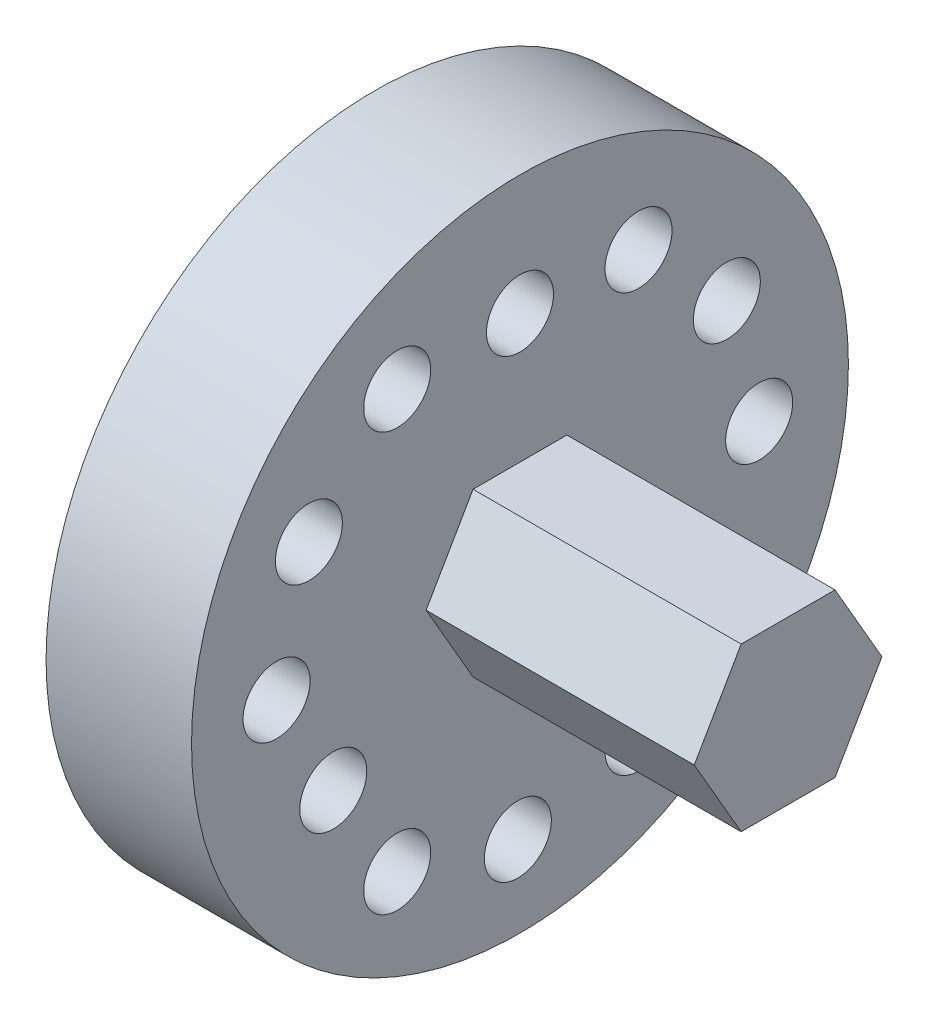
ISO-10303-21;
HEADER;
FILE_DESCRIPTION(('STEP AP214'),'2;1');
FILE_NAME('part.step','',(''),(''),'','','');
FILE_SCHEMA(('AUTOMOTIVE_DESIGN { 1 0 10303 214 1 1 1 1 }'));
ENDSEC;
DATA;
#1=APPLICATION_CONTEXT('core data for automotive mechanical design processes');
#2=APPLICATION_PROTOCOL_DEFINITION('international standard','automotive_design',2000,#1);
#3=PRODUCT_CONTEXT('',#1,'mechanical');
#4=PRODUCT('Part','Part','',(#3));
#5=PRODUCT_RELATED_PRODUCT_CATEGORY('part','',(#4));
#6=PRODUCT_DEFINITION_FORMATION('','',#4);
#7=PRODUCT_DEFINITION_CONTEXT('part definition',#1,'design');
#8=PRODUCT_DEFINITION('design','',#6,#7);
#9=PRODUCT_DEFINITION_SHAPE('','',#8);
#10=(LENGTH_UNIT() NAMED_UNIT(*) SI_UNIT(.MILLI.,.METRE.));
#11=(NAMED_UNIT(*) PLANE_ANGLE_UNIT() SI_UNIT($,.RADIAN.));
#12=(NAMED_UNIT(*) SI_UNIT($,.STERADIAN.) SOLID_ANGLE_UNIT());
#13=UNCERTAINTY_MEASURE_WITH_UNIT(LENGTH_MEASURE(1.E-05),#10,'distance_accuracy_value','');
#14=(GEOMETRIC_REPRESENTATION_CONTEXT(3) GLOBAL_UNCERTAINTY_ASSIGNED_CONTEXT((#13)) GLOBAL_UNIT_ASSIGNED_CONTEXT((#10,
#11,#12)) REPRESENTATION_CONTEXT('',''));
#15=CARTESIAN_POINT('',(0.,0.,0.));
#16=DIRECTION('',(0.,0.,1.));
#17=DIRECTION('',(1.,0.,0.));
#18=AXIS2_PLACEMENT_3D('',#15,#16,#17);
#19=CARTESIAN_POINT('',(10.85,0.,0.));
#20=DIRECTION('',(1.,0.,0.));
#21=DIRECTION('',(0.,0.,-1.));
#22=AXIS2_PLACEMENT_3D('',#19,#20,#21);
#23=PLANE('',#22);
#24=CARTESIAN_POINT('',(10.85,8.64521577321359,15.7458089174074));
#25=DIRECTION('',(1.,0.,0.));
#26=DIRECTION('',(0.,0.,-1.));
#27=AXIS2_PLACEMENT_3D('',#24,#25,#26);
#28=CIRCLE('',#27,2.50000000000076);
#29=CARTESIAN_POINT('',(10.85,8.64521577321359,13.2458089174067));
#30=VERTEX_POINT('',#29);
#31=EDGE_CURVE('E151',#30,#30,#28,.T.);
#32=ORIENTED_EDGE('',*,*,#31,.F.);
#33=EDGE_LOOP('',(#32));
#34=FACE_BOUND('',#33,.T.);
#35=CARTESIAN_POINT('',(10.85,-15.9432414949072,9.15735164928657));
#36=DIRECTION('',(1.,0.,0.));
#37=DIRECTION('',(0.,0.,-1.));
#38=AXIS2_PLACEMENT_3D('',#35,#36,#37);
#39=CIRCLE('',#38,2.50000000000048);
#40=CARTESIAN_POINT('',(10.85,-15.9432414949072,6.65735164928609));
#41=VERTEX_POINT('',#40);
#42=EDGE_CURVE('E163',#41,#41,#39,.T.);
#43=ORIENTED_EDGE('',*,*,#42,.F.);
#44=EDGE_LOOP('',(#43));
#45=FACE_BOUND('',#44,.T.);
#46=CARTESIAN_POINT('',(10.85,-15.9432414949057,-8.84264835071388));
#47=DIRECTION('',(1.,0.,0.));
#48=DIRECTION('',(0.,0.,-1.));
#49=AXIS2_PLACEMENT_3D('',#46,#47,#48);
#50=CIRCLE('',#49,2.50000000000035);
#51=CARTESIAN_POINT('',(10.85,-15.9432414949057,-11.3426483507142));
#52=VERTEX_POINT('',#51);
#53=EDGE_CURVE('E175',#52,#52,#50,.T.);
#54=ORIENTED_EDGE('',*,*,#53,.F.);
#55=EDGE_LOOP('',(#54));
#56=FACE_BOUND('',#55,.T.);
#57=CARTESIAN_POINT('',(10.85,8.64521577321468,-15.4311056188333));
#58=DIRECTION('',(1.,0.,0.));
#59=DIRECTION('',(0.,0.,-1.));
#60=AXIS2_PLACEMENT_3D('',#57,#58,#59);
#61=CIRCLE('',#60,2.49999999999935);
#62=CARTESIAN_POINT('',(10.85,8.64521577321468,-17.9311056188326));
#63=VERTEX_POINT('',#62);
#64=EDGE_CURVE('E187',#63,#63,#61,.T.);
#65=ORIENTED_EDGE('',*,*,#64,.F.);
#66=EDGE_LOOP('',(#65));
#67=FACE_BOUND('',#66,.T.);
#68=CARTESIAN_POINT('',(10.85,-8.30478422678514,-13.6124522708862));
#69=DIRECTION('',(1.,0.,0.));
#70=DIRECTION('',(0.,0.,-1.));
#71=AXIS2_PLACEMENT_3D('',#68,#69,#70);
#72=CIRCLE('',#71,2.50000000000089);
#73=CARTESIAN_POINT('',(10.85,-8.30478422678514,-16.1124522708871));
#74=VERTEX_POINT('',#73);
#75=EDGE_CURVE('E199',#74,#74,#72,.T.);
#76=ORIENTED_EDGE('',*,*,#75,.F.);
#77=EDGE_LOOP('',(#76));
#78=FACE_BOUND('',#77,.T.);
#79=CARTESIAN_POINT('',(10.85,15.5452157732143,0.));
#80=DIRECTION('',(1.,0.,0.));
#81=DIRECTION('',(0.,0.,-1.));
#82=AXIS2_PLACEMENT_3D('',#79,#80,#81);
#83=CIRCLE('',#82,2.5);
#84=CARTESIAN_POINT('',(10.85,15.5452157732143,-2.5));
#85=VERTEX_POINT('',#84);
#86=EDGE_CURVE('E211',#85,#85,#83,.T.);
#87=ORIENTED_EDGE('',*,*,#86,.F.);
#88=EDGE_LOOP('',(#87));
#89=FACE_BOUND('',#88,.T.);
#90=CARTESIAN_POINT('',(10.85,0.,0.));
#91=DIRECTION('',(1.,0.,0.));
#92=DIRECTION('',(0.,0.,-1.));
#93=AXIS2_PLACEMENT_3D('',#90,#91,#92);
#94=CIRCLE('',#93,24.5);
#95=CARTESIAN_POINT('',(10.85,0.,-24.5));
#96=VERTEX_POINT('',#95);
#97=EDGE_CURVE('E11',#96,#96,#94,.T.);
#98=ORIENTED_EDGE('',*,*,#97,.T.);
#99=EDGE_LOOP('',(#98));
#100=FACE_BOUND('',#99,.T.);
#101=CARTESIAN_POINT('',(10.85,15.2336730413342,-8.84264835071259));
#102=DIRECTION('',(1.,0.,0.));
#103=DIRECTION('',(0.,0.,-1.));
#104=AXIS2_PLACEMENT_3D('',#101,#102,#103);
#105=CIRCLE('',#104,2.5);
#106=CARTESIAN_POINT('',(10.85,15.2336730413342,-11.3426483507126));
#107=VERTEX_POINT('',#106);
#108=EDGE_CURVE('E205',#107,#107,#105,.T.);
#109=ORIENTED_EDGE('',*,*,#108,.F.);
#110=EDGE_LOOP('',(#109));
#111=FACE_BOUND('',#110,.T.);
#112=CARTESIAN_POINT('',(10.85,-8.30478422678632,13.927155569459));
#113=DIRECTION('',(1.,0.,0.));
#114=DIRECTION('',(0.,0.,-1.));
#115=AXIS2_PLACEMENT_3D('',#112,#113,#114);
#116=CIRCLE('',#115,2.50000000000128);
#117=CARTESIAN_POINT('',(10.85,-8.30478422678632,11.4271555694577));
#118=VERTEX_POINT('',#117);
#119=EDGE_CURVE('E193',#118,#118,#116,.T.);
#120=ORIENTED_EDGE('',*,*,#119,.F.);
#121=EDGE_LOOP('',(#120));
#122=FACE_BOUND('',#121,.T.);
#123=CARTESIAN_POINT('',(10.85,-0.354784226785372,-17.8426483507141));
#124=DIRECTION('',(1.,0.,0.));
#125=DIRECTION('',(0.,0.,-1.));
#126=AXIS2_PLACEMENT_3D('',#123,#124,#125);
#127=CIRCLE('',#126,2.49999999999915);
#128=CARTESIAN_POINT('',(10.85,-0.354784226785372,-20.3426483507133));
#129=VERTEX_POINT('',#128);
#130=EDGE_CURVE('E181',#129,#129,#127,.T.);
#131=ORIENTED_EDGE('',*,*,#130,.F.);
#132=EDGE_LOOP('',(#131));
#133=FACE_BOUND('',#132,.T.);
#134=CARTESIAN_POINT('',(10.85,-18.3547842267866,0.15735164928614));
#135=DIRECTION('',(1.,0.,0.));
#136=DIRECTION('',(0.,0.,-1.));
#137=AXIS2_PLACEMENT_3D('',#134,#135,#136);
#138=CIRCLE('',#137,2.50000000000031);
#139=CARTESIAN_POINT('',(10.85,-18.3547842267866,-2.34264835071417));
#140=VERTEX_POINT('',#139);
#141=EDGE_CURVE('E169',#140,#140,#138,.T.);
#142=ORIENTED_EDGE('',*,*,#141,.F.);
#143=EDGE_LOOP('',(#142));
#144=FACE_BOUND('',#143,.T.);
#145=CARTESIAN_POINT('',(10.85,-0.354784226786869,18.1573516492868));
#146=DIRECTION('',(1.,0.,0.));
#147=DIRECTION('',(0.,0.,-1.));
#148=AXIS2_PLACEMENT_3D('',#145,#146,#147);
#149=CIRCLE('',#148,2.50000000000138);
#150=CARTESIAN_POINT('',(10.85,-0.354784226786869,15.6573516492854));
#151=VERTEX_POINT('',#150);
#152=EDGE_CURVE('E157',#151,#151,#149,.T.);
#153=ORIENTED_EDGE('',*,*,#152,.F.);
#154=EDGE_LOOP('',(#153));
#155=FACE_BOUND('',#154,.T.);
#156=CARTESIAN_POINT('',(10.85,15.2336730413342,9.15735164928788));
#157=DIRECTION('',(1.,0.,0.));
#158=DIRECTION('',(0.,0.,-1.));
#159=AXIS2_PLACEMENT_3D('',#156,#157,#158);
#160=CIRCLE('',#159,2.50000000000024);
#161=CARTESIAN_POINT('',(10.85,15.2336730413342,6.65735164928764));
#162=VERTEX_POINT('',#161);
#163=EDGE_CURVE('E145',#162,#162,#160,.T.);
#164=ORIENTED_EDGE('',*,*,#163,.F.);
#165=EDGE_LOOP('',(#164));
#166=FACE_BOUND('',#165,.T.);
#167=DIRECTION('',(0.,0.866025403784438,0.5));
#168=VECTOR('',#167,1.);
#169=CARTESIAN_POINT('',(10.85,-0.13086905791027,-7.));
#170=LINE('',#169,#168);
#171=CARTESIAN_POINT('',(10.85,-0.13086905791027,-7.));
#172=VERTEX_POINT('',#171);
#173=CARTESIAN_POINT('',(10.85,5.9313087685808,-3.5));
#174=VERTEX_POINT('',#173);
#175=EDGE_CURVE('E127',#172,#174,#170,.T.);
#176=ORIENTED_EDGE('',*,*,#175,.F.);
#177=DIRECTION('',(0.,0.866025403784439,-0.5));
#178=VECTOR('',#177,1.);
#179=CARTESIAN_POINT('',(10.85,-6.19304688440134,-3.5));
#180=LINE('',#179,#178);
#181=CARTESIAN_POINT('',(10.85,-6.19304688440134,-3.5));
#182=VERTEX_POINT('',#181);
#183=EDGE_CURVE('E124',#182,#172,#180,.T.);
#184=ORIENTED_EDGE('',*,*,#183,.F.);
#185=DIRECTION('',(0.,0.,-1.));
#186=VECTOR('',#185,1.);
#187=CARTESIAN_POINT('',(10.85,-6.19304688440134,3.5));
#188=LINE('',#187,#186);
#189=CARTESIAN_POINT('',(10.85,-6.19304688440134,3.5));
#190=VERTEX_POINT('',#189);
#191=EDGE_CURVE('E83',#190,#182,#188,.T.);
#192=ORIENTED_EDGE('',*,*,#191,.F.);
#193=DIRECTION('',(0.,-0.866025403784439,-0.5));
#194=VECTOR('',#193,1.);
#195=CARTESIAN_POINT('',(10.85,-0.130869057910273,7.));
#196=LINE('',#195,#194);
#197=CARTESIAN_POINT('',(10.85,-0.130869057910273,7.));
#198=VERTEX_POINT('',#197);
#199=EDGE_CURVE('E132',#198,#190,#196,.T.);
#200=ORIENTED_EDGE('',*,*,#199,.F.);
#201=DIRECTION('',(0.,-0.866025403784439,0.5));
#202=VECTOR('',#201,1.);
#203=CARTESIAN_POINT('',(10.85,5.9313087685808,3.5));
#204=LINE('',#203,#202);
#205=CARTESIAN_POINT('',(10.85,5.9313087685808,3.5));
#206=VERTEX_POINT('',#205);
#207=EDGE_CURVE('E113',#206,#198,#204,.T.);
#208=ORIENTED_EDGE('',*,*,#207,.F.);
#209=DIRECTION('',(0.,0.,1.));
#210=VECTOR('',#209,1.);
#211=CARTESIAN_POINT('',(10.85,5.9313087685808,-3.5));
#212=LINE('',#211,#210);
#213=EDGE_CURVE('E129',#174,#206,#212,.T.);
#214=ORIENTED_EDGE('',*,*,#213,.F.);
#215=EDGE_LOOP('',(#176,#184,#192,#200,#208,#214));
#216=FACE_BOUND('',#215,.T.);
#217=ADVANCED_FACE('F40',(#34,#45,#56,#67,#78,#89,#100,#111,#122,#133,#144,#155,#166,#216),#23,.T.);
#218=CARTESIAN_POINT('',(0.,0.,0.));
#219=DIRECTION('',(1.,0.,0.));
#220=DIRECTION('',(0.,0.,-1.));
#221=AXIS2_PLACEMENT_3D('',#218,#219,#220);
#222=PLANE('',#221);
#223=CARTESIAN_POINT('',(0.,0.,0.));
#224=DIRECTION('',(1.,0.,0.));
#225=DIRECTION('',(0.,0.,-1.));
#226=AXIS2_PLACEMENT_3D('',#223,#224,#225);
#227=CIRCLE('',#226,24.5);
#228=CARTESIAN_POINT('',(0.,0.,-24.5));
#229=VERTEX_POINT('',#228);
#230=EDGE_CURVE('E44',#229,#229,#227,.T.);
#231=ORIENTED_EDGE('',*,*,#230,.F.);
#232=EDGE_LOOP('',(#231));
#233=FACE_BOUND('',#232,.T.);
#234=CARTESIAN_POINT('',(0.,15.5452157732143,0.));
#235=DIRECTION('',(1.,0.,0.));
#236=DIRECTION('',(0.,0.,-1.));
#237=AXIS2_PLACEMENT_3D('',#234,#235,#236);
#238=CIRCLE('',#237,2.5);
#239=CARTESIAN_POINT('',(0.,15.5452157732143,-2.5));
#240=VERTEX_POINT('',#239);
#241=EDGE_CURVE('E208',#240,#240,#238,.T.);
#242=ORIENTED_EDGE('',*,*,#241,.T.);
#243=EDGE_LOOP('',(#242));
#244=FACE_BOUND('',#243,.T.);
#245=CARTESIAN_POINT('',(0.,15.2336730413342,-8.84264835071259));
#246=DIRECTION('',(1.,0.,0.));
#247=DIRECTION('',(0.,0.,-1.));
#248=AXIS2_PLACEMENT_3D('',#245,#246,#247);
#249=CIRCLE('',#248,2.5);
#250=CARTESIAN_POINT('',(0.,15.2336730413342,-11.3426483507126));
#251=VERTEX_POINT('',#250);
#252=EDGE_CURVE('E202',#251,#251,#249,.T.);
#253=ORIENTED_EDGE('',*,*,#252,.T.);
#254=EDGE_LOOP('',(#253));
#255=FACE_BOUND('',#254,.T.);
#256=CARTESIAN_POINT('',(0.,-8.30478422678514,-13.6124522708862));
#257=DIRECTION('',(1.,0.,0.));
#258=DIRECTION('',(0.,0.,-1.));
#259=AXIS2_PLACEMENT_3D('',#256,#257,#258);
#260=CIRCLE('',#259,2.50000000000089);
#261=CARTESIAN_POINT('',(0.,-8.30478422678514,-16.1124522708871));
#262=VERTEX_POINT('',#261);
#263=EDGE_CURVE('E196',#262,#262,#260,.T.);
#264=ORIENTED_EDGE('',*,*,#263,.T.);
#265=EDGE_LOOP('',(#264));
#266=FACE_BOUND('',#265,.T.);
#267=CARTESIAN_POINT('',(0.,-8.30478422678632,13.927155569459));
#268=DIRECTION('',(1.,0.,0.));
#269=DIRECTION('',(0.,0.,-1.));
#270=AXIS2_PLACEMENT_3D('',#267,#268,#269);
#271=CIRCLE('',#270,2.50000000000128);
#272=CARTESIAN_POINT('',(0.,-8.30478422678632,11.4271555694577));
#273=VERTEX_POINT('',#272);
#274=EDGE_CURVE('E190',#273,#273,#271,.T.);
#275=ORIENTED_EDGE('',*,*,#274,.T.);
#276=EDGE_LOOP('',(#275));
#277=FACE_BOUND('',#276,.T.);
#278=CARTESIAN_POINT('',(0.,8.64521577321468,-15.4311056188333));
#279=DIRECTION('',(1.,0.,0.));
#280=DIRECTION('',(0.,0.,-1.));
#281=AXIS2_PLACEMENT_3D('',#278,#279,#280);
#282=CIRCLE('',#281,2.49999999999935);
#283=CARTESIAN_POINT('',(0.,8.64521577321468,-17.9311056188326));
#284=VERTEX_POINT('',#283);
#285=EDGE_CURVE('E184',#284,#284,#282,.T.);
#286=ORIENTED_EDGE('',*,*,#285,.T.);
#287=EDGE_LOOP('',(#286));
#288=FACE_BOUND('',#287,.T.);
#289=CARTESIAN_POINT('',(0.,-0.354784226785372,-17.8426483507141));
#290=DIRECTION('',(1.,0.,0.));
#291=DIRECTION('',(0.,0.,-1.));
#292=AXIS2_PLACEMENT_3D('',#289,#290,#291);
#293=CIRCLE('',#292,2.49999999999915);
#294=CARTESIAN_POINT('',(0.,-0.354784226785372,-20.3426483507133));
#295=VERTEX_POINT('',#294);
#296=EDGE_CURVE('E178',#295,#295,#293,.T.);
#297=ORIENTED_EDGE('',*,*,#296,.T.);
#298=EDGE_LOOP('',(#297));
#299=FACE_BOUND('',#298,.T.);
#300=CARTESIAN_POINT('',(0.,-15.9432414949057,-8.84264835071388));
#301=DIRECTION('',(1.,0.,0.));
#302=DIRECTION('',(0.,0.,-1.));
#303=AXIS2_PLACEMENT_3D('',#300,#301,#302);
#304=CIRCLE('',#303,2.50000000000035);
#305=CARTESIAN_POINT('',(0.,-15.9432414949057,-11.3426483507142));
#306=VERTEX_POINT('',#305);
#307=EDGE_CURVE('E172',#306,#306,#304,.T.);
#308=ORIENTED_EDGE('',*,*,#307,.T.);
#309=EDGE_LOOP('',(#308));
#310=FACE_BOUND('',#309,.T.);
#311=CARTESIAN_POINT('',(0.,-18.3547842267866,0.15735164928614));
#312=DIRECTION('',(1.,0.,0.));
#313=DIRECTION('',(0.,0.,-1.));
#314=AXIS2_PLACEMENT_3D('',#311,#312,#313);
#315=CIRCLE('',#314,2.50000000000031);
#316=CARTESIAN_POINT('',(0.,-18.3547842267866,-2.34264835071417));
#317=VERTEX_POINT('',#316);
#318=EDGE_CURVE('E166',#317,#317,#315,.T.);
#319=ORIENTED_EDGE('',*,*,#318,.T.);
#320=EDGE_LOOP('',(#319));
#321=FACE_BOUND('',#320,.T.);
#322=CARTESIAN_POINT('',(0.,-15.9432414949072,9.15735164928657));
#323=DIRECTION('',(1.,0.,0.));
#324=DIRECTION('',(0.,0.,-1.));
#325=AXIS2_PLACEMENT_3D('',#322,#323,#324);
#326=CIRCLE('',#325,2.50000000000048);
#327=CARTESIAN_POINT('',(0.,-15.9432414949072,6.65735164928609));
#328=VERTEX_POINT('',#327);
#329=EDGE_CURVE('E160',#328,#328,#326,.T.);
#330=ORIENTED_EDGE('',*,*,#329,.T.);
#331=EDGE_LOOP('',(#330));
#332=FACE_BOUND('',#331,.T.);
#333=CARTESIAN_POINT('',(0.,-0.354784226786869,18.1573516492868));
#334=DIRECTION('',(1.,0.,0.));
#335=DIRECTION('',(0.,0.,-1.));
#336=AXIS2_PLACEMENT_3D('',#333,#334,#335);
#337=CIRCLE('',#336,2.50000000000138);
#338=CARTESIAN_POINT('',(0.,-0.354784226786869,15.6573516492854));
#339=VERTEX_POINT('',#338);
#340=EDGE_CURVE('E154',#339,#339,#337,.T.);
#341=ORIENTED_EDGE('',*,*,#340,.T.);
#342=EDGE_LOOP('',(#341));
#343=FACE_BOUND('',#342,.T.);
#344=CARTESIAN_POINT('',(0.,8.64521577321359,15.7458089174074));
#345=DIRECTION('',(1.,0.,0.));
#346=DIRECTION('',(0.,0.,-1.));
#347=AXIS2_PLACEMENT_3D('',#344,#345,#346);
#348=CIRCLE('',#347,2.50000000000076);
#349=CARTESIAN_POINT('',(0.,8.64521577321359,13.2458089174067));
#350=VERTEX_POINT('',#349);
#351=EDGE_CURVE('E148',#350,#350,#348,.T.);
#352=ORIENTED_EDGE('',*,*,#351,.T.);
#353=EDGE_LOOP('',(#352));
#354=FACE_BOUND('',#353,.T.);
#355=CARTESIAN_POINT('',(0.,15.2336730413342,9.15735164928788));
#356=DIRECTION('',(1.,0.,0.));
#357=DIRECTION('',(0.,0.,-1.));
#358=AXIS2_PLACEMENT_3D('',#355,#356,#357);
#359=CIRCLE('',#358,2.50000000000024);
#360=CARTESIAN_POINT('',(0.,15.2336730413342,6.65735164928764));
#361=VERTEX_POINT('',#360);
#362=EDGE_CURVE('E144',#361,#361,#359,.T.);
#363=ORIENTED_EDGE('',*,*,#362,.T.);
#364=EDGE_LOOP('',(#363));
#365=FACE_BOUND('',#364,.T.);
#366=ADVANCED_FACE('F217',(#233,#244,#255,#266,#277,#288,#299,#310,#321,#332,#343,#354,#365),
#222,.F.);
#367=CARTESIAN_POINT('',(10.85,0.,0.));
#368=DIRECTION('',(-1.,0.,0.));
#369=DIRECTION('',(0.,0.,1.));
#370=AXIS2_PLACEMENT_3D('',#367,#368,#369);
#371=CYLINDRICAL_SURFACE('',#370,24.5);
#372=ORIENTED_EDGE('',*,*,#97,.F.);
#373=EDGE_LOOP('',(#372));
#374=FACE_BOUND('',#373,.T.);
#375=ORIENTED_EDGE('',*,*,#230,.T.);
#376=EDGE_LOOP('',(#375));
#377=FACE_BOUND('',#376,.T.);
#378=ADVANCED_FACE('F42',(#374,#377),#371,.T.);
#379=CARTESIAN_POINT('',(10.85,15.5452157732143,0.));
#380=DIRECTION('',(-1.,0.,0.));
#381=DIRECTION('',(0.,0.,1.));
#382=AXIS2_PLACEMENT_3D('',#379,#380,#381);
#383=CYLINDRICAL_SURFACE('',#382,2.5);
#384=ORIENTED_EDGE('',*,*,#86,.T.);
#385=EDGE_LOOP('',(#384));
#386=FACE_BOUND('',#385,.T.);
#387=ORIENTED_EDGE('',*,*,#241,.F.);
#388=EDGE_LOOP('',(#387));
#389=FACE_BOUND('',#388,.T.);
#390=ADVANCED_FACE('F220',(#386,#389),#383,.F.);
#391=CARTESIAN_POINT('',(10.85,15.2336730413342,-8.84264835071259));
#392=DIRECTION('',(-1.,0.,0.));
#393=DIRECTION('',(0.,0.,1.));
#394=AXIS2_PLACEMENT_3D('',#391,#392,#393);
#395=CYLINDRICAL_SURFACE('',#394,2.5);
#396=ORIENTED_EDGE('',*,*,#108,.T.);
#397=EDGE_LOOP('',(#396));
#398=FACE_BOUND('',#397,.T.);
#399=ORIENTED_EDGE('',*,*,#252,.F.);
#400=EDGE_LOOP('',(#399));
#401=FACE_BOUND('',#400,.T.);
#402=ADVANCED_FACE('F222',(#398,#401),#395,.F.);
#403=CARTESIAN_POINT('',(10.85,-8.30478422678514,-13.6124522708862));
#404=DIRECTION('',(-1.,0.,0.));
#405=DIRECTION('',(0.,0.,1.));
#406=AXIS2_PLACEMENT_3D('',#403,#404,#405);
#407=CYLINDRICAL_SURFACE('',#406,2.50000000000089);
#408=ORIENTED_EDGE('',*,*,#75,.T.);
#409=EDGE_LOOP('',(#408));
#410=FACE_BOUND('',#409,.T.);
#411=ORIENTED_EDGE('',*,*,#263,.F.);
#412=EDGE_LOOP('',(#411));
#413=FACE_BOUND('',#412,.T.);
#414=ADVANCED_FACE('F229',(#410,#413),#407,.F.);
#415=CARTESIAN_POINT('',(10.85,-8.30478422678632,13.927155569459));
#416=DIRECTION('',(-1.,0.,0.));
#417=DIRECTION('',(0.,0.,1.));
#418=AXIS2_PLACEMENT_3D('',#415,#416,#417);
#419=CYLINDRICAL_SURFACE('',#418,2.50000000000128);
#420=ORIENTED_EDGE('',*,*,#119,.T.);
#421=EDGE_LOOP('',(#420));
#422=FACE_BOUND('',#421,.T.);
#423=ORIENTED_EDGE('',*,*,#274,.F.);
#424=EDGE_LOOP('',(#423));
#425=FACE_BOUND('',#424,.T.);
#426=ADVANCED_FACE('F327',(#422,#425),#419,.F.);
#427=CARTESIAN_POINT('',(10.85,8.64521577321468,-15.4311056188333));
#428=DIRECTION('',(-1.,0.,0.));
#429=DIRECTION('',(0.,0.,1.));
#430=AXIS2_PLACEMENT_3D('',#427,#428,#429);
#431=CYLINDRICAL_SURFACE('',#430,2.49999999999935);
#432=ORIENTED_EDGE('',*,*,#64,.T.);
#433=EDGE_LOOP('',(#432));
#434=FACE_BOUND('',#433,.T.);
#435=ORIENTED_EDGE('',*,*,#285,.F.);
#436=EDGE_LOOP('',(#435));
#437=FACE_BOUND('',#436,.T.);
#438=ADVANCED_FACE('F323',(#434,#437),#431,.F.);
#439=CARTESIAN_POINT('',(10.85,-0.354784226785372,-17.8426483507141));
#440=DIRECTION('',(-1.,0.,0.));
#441=DIRECTION('',(0.,0.,1.));
#442=AXIS2_PLACEMENT_3D('',#439,#440,#441);
#443=CYLINDRICAL_SURFACE('',#442,2.49999999999915);
#444=ORIENTED_EDGE('',*,*,#130,.T.);
#445=EDGE_LOOP('',(#444));
#446=FACE_BOUND('',#445,.T.);
#447=ORIENTED_EDGE('',*,*,#296,.F.);
#448=EDGE_LOOP('',(#447));
#449=FACE_BOUND('',#448,.T.);
#450=ADVANCED_FACE('F319',(#446,#449),#443,.F.);
#451=CARTESIAN_POINT('',(10.85,-15.9432414949057,-8.84264835071388));
#452=DIRECTION('',(-1.,0.,0.));
#453=DIRECTION('',(0.,0.,1.));
#454=AXIS2_PLACEMENT_3D('',#451,#452,#453);
#455=CYLINDRICAL_SURFACE('',#454,2.50000000000035);
#456=ORIENTED_EDGE('',*,*,#53,.T.);
#457=EDGE_LOOP('',(#456));
#458=FACE_BOUND('',#457,.T.);
#459=ORIENTED_EDGE('',*,*,#307,.F.);
#460=EDGE_LOOP('',(#459));
#461=FACE_BOUND('',#460,.T.);
#462=ADVANCED_FACE('F315',(#458,#461),#455,.F.);
#463=CARTESIAN_POINT('',(10.85,-18.3547842267866,0.15735164928614));
#464=DIRECTION('',(-1.,0.,0.));
#465=DIRECTION('',(0.,0.,1.));
#466=AXIS2_PLACEMENT_3D('',#463,#464,#465);
#467=CYLINDRICAL_SURFACE('',#466,2.50000000000031);
#468=ORIENTED_EDGE('',*,*,#141,.T.);
#469=EDGE_LOOP('',(#468));
#470=FACE_BOUND('',#469,.T.);
#471=ORIENTED_EDGE('',*,*,#318,.F.);
#472=EDGE_LOOP('',(#471));
#473=FACE_BOUND('',#472,.T.);
#474=ADVANCED_FACE('F311',(#470,#473),#467,.F.);
#475=CARTESIAN_POINT('',(10.85,-15.9432414949072,9.15735164928657));
#476=DIRECTION('',(-1.,0.,0.));
#477=DIRECTION('',(0.,0.,1.));
#478=AXIS2_PLACEMENT_3D('',#475,#476,#477);
#479=CYLINDRICAL_SURFACE('',#478,2.50000000000048);
#480=ORIENTED_EDGE('',*,*,#42,.T.);
#481=EDGE_LOOP('',(#480));
#482=FACE_BOUND('',#481,.T.);
#483=ORIENTED_EDGE('',*,*,#329,.F.);
#484=EDGE_LOOP('',(#483));
#485=FACE_BOUND('',#484,.T.);
#486=ADVANCED_FACE('F307',(#482,#485),#479,.F.);
#487=CARTESIAN_POINT('',(10.85,-0.354784226786869,18.1573516492868));
#488=DIRECTION('',(-1.,0.,0.));
#489=DIRECTION('',(0.,0.,1.));
#490=AXIS2_PLACEMENT_3D('',#487,#488,#489);
#491=CYLINDRICAL_SURFACE('',#490,2.50000000000138);
#492=ORIENTED_EDGE('',*,*,#152,.T.);
#493=EDGE_LOOP('',(#492));
#494=FACE_BOUND('',#493,.T.);
#495=ORIENTED_EDGE('',*,*,#340,.F.);
#496=EDGE_LOOP('',(#495));
#497=FACE_BOUND('',#496,.T.);
#498=ADVANCED_FACE('F303',(#494,#497),#491,.F.);
#499=CARTESIAN_POINT('',(10.85,8.64521577321359,15.7458089174074));
#500=DIRECTION('',(-1.,0.,0.));
#501=DIRECTION('',(0.,0.,1.));
#502=AXIS2_PLACEMENT_3D('',#499,#500,#501);
#503=CYLINDRICAL_SURFACE('',#502,2.50000000000076);
#504=ORIENTED_EDGE('',*,*,#31,.T.);
#505=EDGE_LOOP('',(#504));
#506=FACE_BOUND('',#505,.T.);
#507=ORIENTED_EDGE('',*,*,#351,.F.);
#508=EDGE_LOOP('',(#507));
#509=FACE_BOUND('',#508,.T.);
#510=ADVANCED_FACE('F299',(#506,#509),#503,.F.);
#511=CARTESIAN_POINT('',(10.85,15.2336730413342,9.15735164928788));
#512=DIRECTION('',(-1.,0.,0.));
#513=DIRECTION('',(0.,0.,1.));
#514=AXIS2_PLACEMENT_3D('',#511,#512,#513);
#515=CYLINDRICAL_SURFACE('',#514,2.50000000000024);
#516=ORIENTED_EDGE('',*,*,#163,.T.);
#517=EDGE_LOOP('',(#516));
#518=FACE_BOUND('',#517,.T.);
#519=ORIENTED_EDGE('',*,*,#362,.F.);
#520=EDGE_LOOP('',(#519));
#521=FACE_BOUND('',#520,.T.);
#522=ADVANCED_FACE('F296',(#518,#521),#515,.F.);
#523=CARTESIAN_POINT('',(30.85,-6.19304688440134,-3.5));
#524=DIRECTION('',(0.,0.5,0.866025403784439));
#525=DIRECTION('',(0.,-0.866025403784439,0.5));
#526=AXIS2_PLACEMENT_3D('',#523,#524,#525);
#527=PLANE('',#526);
#528=ORIENTED_EDGE('',*,*,#183,.T.);
#529=DIRECTION('',(-1.,0.,0.));
#530=VECTOR('',#529,1.);
#531=CARTESIAN_POINT('',(30.85,-0.13086905791027,-7.));
#532=LINE('',#531,#530);
#533=CARTESIAN_POINT('',(30.85,-0.13086905791027,-7.));
#534=VERTEX_POINT('',#533);
#535=EDGE_CURVE('E142',#534,#172,#532,.T.);
#536=ORIENTED_EDGE('',*,*,#535,.F.);
#537=DIRECTION('',(0.,0.866025403784439,-0.5));
#538=VECTOR('',#537,1.);
#539=CARTESIAN_POINT('',(30.85,-6.19304688440134,-3.5));
#540=LINE('',#539,#538);
#541=CARTESIAN_POINT('',(30.85,-6.19304688440134,-3.5));
#542=VERTEX_POINT('',#541);
#543=EDGE_CURVE('E135',#542,#534,#540,.T.);
#544=ORIENTED_EDGE('',*,*,#543,.F.);
#545=DIRECTION('',(-1.,0.,0.));
#546=VECTOR('',#545,1.);
#547=CARTESIAN_POINT('',(30.85,-6.19304688440134,-3.5));
#548=LINE('',#547,#546);
#549=EDGE_CURVE('E120',#542,#182,#548,.T.);
#550=ORIENTED_EDGE('',*,*,#549,.T.);
#551=EDGE_LOOP('',(#528,#536,#544,#550));
#552=FACE_BOUND('',#551,.T.);
#553=ADVANCED_FACE('F277',(#552),#527,.F.);
#554=CARTESIAN_POINT('',(30.85,-0.13086905791027,-7.));
#555=DIRECTION('',(0.,-0.5,0.866025403784439));
#556=DIRECTION('',(0.,-0.866025403784439,-0.5));
#557=AXIS2_PLACEMENT_3D('',#554,#555,#556);
#558=PLANE('',#557);
#559=ORIENTED_EDGE('',*,*,#175,.T.);
#560=DIRECTION('',(-1.,0.,0.));
#561=VECTOR('',#560,1.);
#562=CARTESIAN_POINT('',(30.85,5.9313087685808,-3.5));
#563=LINE('',#562,#561);
#564=CARTESIAN_POINT('',(30.85,5.9313087685808,-3.5));
#565=VERTEX_POINT('',#564);
#566=EDGE_CURVE('E139',#565,#174,#563,.T.);
#567=ORIENTED_EDGE('',*,*,#566,.F.);
#568=DIRECTION('',(0.,0.866025403784438,0.5));
#569=VECTOR('',#568,1.);
#570=CARTESIAN_POINT('',(30.85,-0.13086905791027,-7.));
#571=LINE('',#570,#569);
#572=EDGE_CURVE('E91',#534,#565,#571,.T.);
#573=ORIENTED_EDGE('',*,*,#572,.F.);
#574=ORIENTED_EDGE('',*,*,#535,.T.);
#575=EDGE_LOOP('',(#559,#567,#573,#574));
#576=FACE_BOUND('',#575,.T.);
#577=ADVANCED_FACE('F269',(#576),#558,.F.);
#578=CARTESIAN_POINT('',(30.85,5.9313087685808,-3.5));
#579=DIRECTION('',(0.,-1.,0.));
#580=DIRECTION('',(0.,0.,-1.));
#581=AXIS2_PLACEMENT_3D('',#578,#579,#580);
#582=PLANE('',#581);
#583=ORIENTED_EDGE('',*,*,#213,.T.);
#584=DIRECTION('',(-1.,0.,0.));
#585=VECTOR('',#584,1.);
#586=CARTESIAN_POINT('',(30.85,5.9313087685808,3.5));
#587=LINE('',#586,#585);
#588=CARTESIAN_POINT('',(30.85,5.9313087685808,3.5));
#589=VERTEX_POINT('',#588);
#590=EDGE_CURVE('E116',#589,#206,#587,.T.);
#591=ORIENTED_EDGE('',*,*,#590,.F.);
#592=DIRECTION('',(0.,0.,1.));
#593=VECTOR('',#592,1.);
#594=CARTESIAN_POINT('',(30.85,5.9313087685808,-3.5));
#595=LINE('',#594,#593);
#596=EDGE_CURVE('E104',#565,#589,#595,.T.);
#597=ORIENTED_EDGE('',*,*,#596,.F.);
#598=ORIENTED_EDGE('',*,*,#566,.T.);
#599=EDGE_LOOP('',(#583,#591,#597,#598));
#600=FACE_BOUND('',#599,.T.);
#601=ADVANCED_FACE('F272',(#600),#582,.F.);
#602=CARTESIAN_POINT('',(30.85,5.9313087685808,3.5));
#603=DIRECTION('',(0.,-0.5,-0.866025403784439));
#604=DIRECTION('',(0.,0.866025403784439,-0.5));
#605=AXIS2_PLACEMENT_3D('',#602,#603,#604);
#606=PLANE('',#605);
#607=ORIENTED_EDGE('',*,*,#207,.T.);
#608=DIRECTION('',(-1.,0.,0.));
#609=VECTOR('',#608,1.);
#610=CARTESIAN_POINT('',(30.85,-0.130869057910273,7.));
#611=LINE('',#610,#609);
#612=CARTESIAN_POINT('',(30.85,-0.130869057910273,7.));
#613=VERTEX_POINT('',#612);
#614=EDGE_CURVE('E110',#613,#198,#611,.T.);
#615=ORIENTED_EDGE('',*,*,#614,.F.);
#616=DIRECTION('',(0.,-0.866025403784439,0.5));
#617=VECTOR('',#616,1.);
#618=CARTESIAN_POINT('',(30.85,5.9313087685808,3.5));
#619=LINE('',#618,#617);
#620=EDGE_CURVE('E98',#589,#613,#619,.T.);
#621=ORIENTED_EDGE('',*,*,#620,.F.);
#622=ORIENTED_EDGE('',*,*,#590,.T.);
#623=EDGE_LOOP('',(#607,#615,#621,#622));
#624=FACE_BOUND('',#623,.T.);
#625=ADVANCED_FACE('F111',(#624),#606,.F.);
#626=CARTESIAN_POINT('',(30.85,-0.130869057910273,7.));
#627=DIRECTION('',(0.,0.5,-0.866025403784439));
#628=DIRECTION('',(0.,0.866025403784439,0.5));
#629=AXIS2_PLACEMENT_3D('',#626,#627,#628);
#630=PLANE('',#629);
#631=ORIENTED_EDGE('',*,*,#199,.T.);
#632=DIRECTION('',(-1.,0.,0.));
#633=VECTOR('',#632,1.);
#634=CARTESIAN_POINT('',(30.85,-6.19304688440134,3.5));
#635=LINE('',#634,#633);
#636=CARTESIAN_POINT('',(30.85,-6.19304688440134,3.5));
#637=VERTEX_POINT('',#636);
#638=EDGE_CURVE('E55',#637,#190,#635,.T.);
#639=ORIENTED_EDGE('',*,*,#638,.F.);
#640=DIRECTION('',(0.,-0.866025403784439,-0.5));
#641=VECTOR('',#640,1.);
#642=CARTESIAN_POINT('',(30.85,-0.130869057910273,7.));
#643=LINE('',#642,#641);
#644=EDGE_CURVE('E102',#613,#637,#643,.T.);
#645=ORIENTED_EDGE('',*,*,#644,.F.);
#646=ORIENTED_EDGE('',*,*,#614,.T.);
#647=EDGE_LOOP('',(#631,#639,#645,#646));
#648=FACE_BOUND('',#647,.T.);
#649=ADVANCED_FACE('F118',(#648),#630,.F.);
#650=CARTESIAN_POINT('',(30.85,-6.19304688440134,3.5));
#651=DIRECTION('',(0.,1.,0.));
#652=DIRECTION('',(0.,0.,1.));
#653=AXIS2_PLACEMENT_3D('',#650,#651,#652);
#654=PLANE('',#653);
#655=ORIENTED_EDGE('',*,*,#191,.T.);
#656=ORIENTED_EDGE('',*,*,#549,.F.);
#657=DIRECTION('',(0.,0.,-1.));
#658=VECTOR('',#657,1.);
#659=CARTESIAN_POINT('',(30.85,-6.19304688440134,3.5));
#660=LINE('',#659,#658);
#661=EDGE_CURVE('E63',#637,#542,#660,.T.);
#662=ORIENTED_EDGE('',*,*,#661,.F.);
#663=ORIENTED_EDGE('',*,*,#638,.T.);
#664=EDGE_LOOP('',(#655,#656,#662,#663));
#665=FACE_BOUND('',#664,.T.);
#666=ADVANCED_FACE('F278',(#665),#654,.F.);
#667=CARTESIAN_POINT('',(30.85,0.,0.));
#668=DIRECTION('',(1.,0.,0.));
#669=DIRECTION('',(0.,0.,-1.));
#670=AXIS2_PLACEMENT_3D('',#667,#668,#669);
#671=PLANE('',#670);
#672=ORIENTED_EDGE('',*,*,#543,.T.);
#673=ORIENTED_EDGE('',*,*,#572,.T.);
#674=ORIENTED_EDGE('',*,*,#596,.T.);
#675=ORIENTED_EDGE('',*,*,#620,.T.);
#676=ORIENTED_EDGE('',*,*,#644,.T.);
#677=ORIENTED_EDGE('',*,*,#661,.T.);
#678=EDGE_LOOP('',(#672,#673,#674,#675,#676,#677));
#679=FACE_BOUND('',#678,.T.);
#680=ADVANCED_FACE('F100',(#679),#671,.T.);
#681=CLOSED_SHELL('',(#217,#366,#378,#390,#402,#414,#426,#438,#450,#462,#474,#486,#498,#510,
#522,#553,#577,#601,#625,#649,#666,#680));
#682=MANIFOLD_SOLID_BREP('B2',#681);
#683=ADVANCED_BREP_SHAPE_REPRESENTATION('',(#18,#682),#14);
#684=SHAPE_DEFINITION_REPRESENTATION(#9,#683);
ENDSEC;
END-ISO-10303-21;
